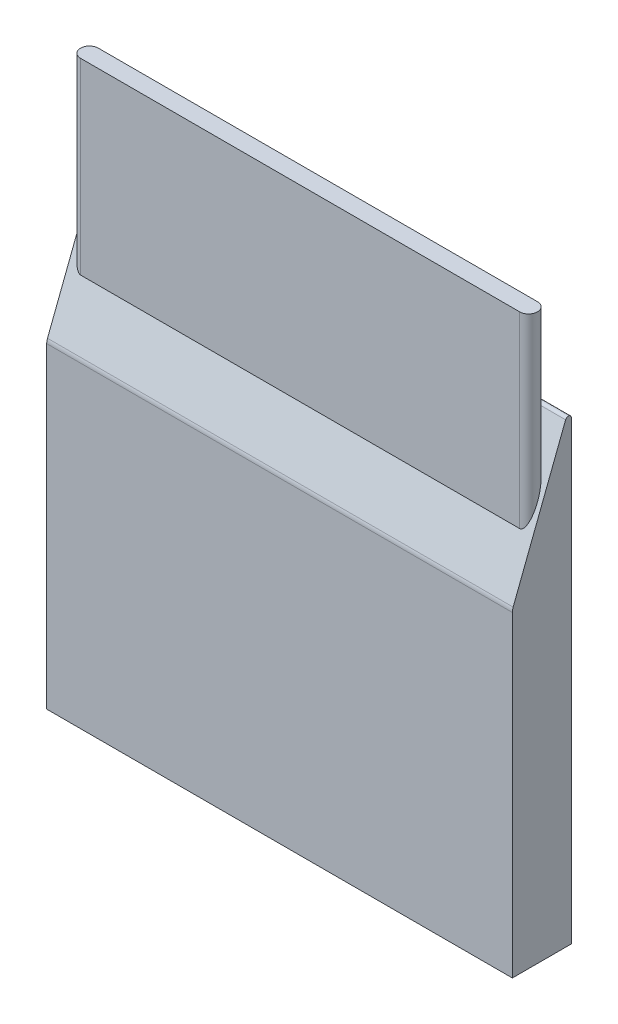
ISO-10303-21;
HEADER;
FILE_DESCRIPTION(('STEP AP214'),'2;1');
FILE_NAME('part.step','',(''),(''),'','','');
FILE_SCHEMA(('AUTOMOTIVE_DESIGN { 1 0 10303 214 1 1 1 1 }'));
ENDSEC;
DATA;
#1=APPLICATION_CONTEXT('core data for automotive mechanical design processes');
#2=APPLICATION_PROTOCOL_DEFINITION('international standard','automotive_design',2000,#1);
#3=PRODUCT_CONTEXT('',#1,'mechanical');
#4=PRODUCT('Part','Part','',(#3));
#5=PRODUCT_RELATED_PRODUCT_CATEGORY('part','',(#4));
#6=PRODUCT_DEFINITION_FORMATION('','',#4);
#7=PRODUCT_DEFINITION_CONTEXT('part definition',#1,'design');
#8=PRODUCT_DEFINITION('design','',#6,#7);
#9=PRODUCT_DEFINITION_SHAPE('','',#8);
#10=(LENGTH_UNIT() NAMED_UNIT(*) SI_UNIT(.MILLI.,.METRE.));
#11=(NAMED_UNIT(*) PLANE_ANGLE_UNIT() SI_UNIT($,.RADIAN.));
#12=(NAMED_UNIT(*) SI_UNIT($,.STERADIAN.) SOLID_ANGLE_UNIT());
#13=UNCERTAINTY_MEASURE_WITH_UNIT(LENGTH_MEASURE(1.E-05),#10,'distance_accuracy_value','');
#14=(GEOMETRIC_REPRESENTATION_CONTEXT(3) GLOBAL_UNCERTAINTY_ASSIGNED_CONTEXT((#13)) GLOBAL_UNIT_ASSIGNED_CONTEXT((#10,
#11,#12)) REPRESENTATION_CONTEXT('',''));
#15=CARTESIAN_POINT('',(0.,0.,0.));
#16=DIRECTION('',(0.,0.,1.));
#17=DIRECTION('',(1.,0.,0.));
#18=AXIS2_PLACEMENT_3D('',#15,#16,#17);
#19=CARTESIAN_POINT('',(65.0657613172395,-0.140861159929711,4.99999999999997));
#20=DIRECTION('',(0.,1.,0.));
#21=DIRECTION('',(0.,0.,1.));
#22=AXIS2_PLACEMENT_3D('',#19,#20,#21);
#23=CYLINDRICAL_SURFACE('',#22,1.5);
#24=DIRECTION('',(0.,1.,0.));
#25=VECTOR('',#24,1.);
#26=CARTESIAN_POINT('',(65.0657613172395,-0.140861159929711,3.49999999999999));
#27=LINE('',#26,#25);
#28=CARTESIAN_POINT('',(65.0657613172395,-0.140861159929711,3.49999999999999));
#29=VERTEX_POINT('',#28);
#30=CARTESIAN_POINT('',(65.0657613172395,34.8591388400703,3.49999999999999));
#31=VERTEX_POINT('',#30);
#32=EDGE_CURVE('E45',#29,#31,#27,.T.);
#33=ORIENTED_EDGE('',*,*,#32,.T.);
#34=CARTESIAN_POINT('',(65.0657613172395,34.8591388400703,4.99999999999997));
#35=DIRECTION('',(0.,1.,0.));
#36=DIRECTION('',(0.,0.,1.));
#37=AXIS2_PLACEMENT_3D('',#34,#35,#36);
#38=CIRCLE('',#37,1.5);
#39=CARTESIAN_POINT('',(65.0657613172395,34.8591388400703,6.49999999999998));
#40=VERTEX_POINT('',#39);
#41=EDGE_CURVE('E82',#40,#31,#38,.T.);
#42=ORIENTED_EDGE('',*,*,#41,.F.);
#43=DIRECTION('',(0.,1.,0.));
#44=VECTOR('',#43,1.);
#45=CARTESIAN_POINT('',(65.0657613172395,-0.140861159929711,6.49999999999998));
#46=LINE('',#45,#44);
#47=CARTESIAN_POINT('',(65.0657613172395,-0.140861159929711,6.49999999999998));
#48=VERTEX_POINT('',#47);
#49=EDGE_CURVE('E12',#48,#40,#46,.T.);
#50=ORIENTED_EDGE('',*,*,#49,.F.);
#51=CARTESIAN_POINT('',(65.0657613172395,-0.140861159929711,4.99999999999997));
#52=DIRECTION('',(0.,1.,0.));
#53=DIRECTION('',(0.,0.,1.));
#54=AXIS2_PLACEMENT_3D('',#51,#52,#53);
#55=CIRCLE('',#54,1.5);
#56=EDGE_CURVE('E83',#48,#29,#55,.T.);
#57=ORIENTED_EDGE('',*,*,#56,.T.);
#58=EDGE_LOOP('',(#33,#42,#50,#57));
#59=FACE_BOUND('',#58,.T.);
#60=ADVANCED_FACE('F42',(#59),#23,.T.);
#61=CARTESIAN_POINT('',(65.0657613172395,-0.140861159929711,6.49999999999998));
#62=DIRECTION('',(0.,0.,1.));
#63=DIRECTION('',(1.,0.,0.));
#64=AXIS2_PLACEMENT_3D('',#61,#62,#63);
#65=PLANE('',#64);
#66=ORIENTED_EDGE('',*,*,#49,.T.);
#67=DIRECTION('',(1.,0.,0.));
#68=VECTOR('',#67,1.);
#69=CARTESIAN_POINT('',(65.0657613172395,34.8591388400703,6.49999999999998));
#70=LINE('',#69,#68);
#71=CARTESIAN_POINT('',(-9.43423868276049,34.8591388400703,6.5));
#72=VERTEX_POINT('',#71);
#73=EDGE_CURVE('E99',#72,#40,#70,.T.);
#74=ORIENTED_EDGE('',*,*,#73,.F.);
#75=DIRECTION('',(0.,1.,0.));
#76=VECTOR('',#75,1.);
#77=CARTESIAN_POINT('',(-9.43423868276049,-0.140861159929711,6.5));
#78=LINE('',#77,#76);
#79=CARTESIAN_POINT('',(-9.43423868276049,-0.140861159929711,6.5));
#80=VERTEX_POINT('',#79);
#81=EDGE_CURVE('E50',#80,#72,#78,.T.);
#82=ORIENTED_EDGE('',*,*,#81,.F.);
#83=DIRECTION('',(1.,0.,0.));
#84=VECTOR('',#83,1.);
#85=CARTESIAN_POINT('',(65.0657613172395,-0.140861159929711,6.49999999999998));
#86=LINE('',#85,#84);
#87=EDGE_CURVE('E88',#80,#48,#86,.T.);
#88=ORIENTED_EDGE('',*,*,#87,.T.);
#89=EDGE_LOOP('',(#66,#74,#82,#88));
#90=FACE_BOUND('',#89,.T.);
#91=ADVANCED_FACE('F114',(#90),#65,.T.);
#92=CARTESIAN_POINT('',(-9.43423868276049,-0.140861159929711,5.));
#93=DIRECTION('',(0.,1.,0.));
#94=DIRECTION('',(0.,0.,1.));
#95=AXIS2_PLACEMENT_3D('',#92,#93,#94);
#96=CYLINDRICAL_SURFACE('',#95,1.5);
#97=ORIENTED_EDGE('',*,*,#81,.T.);
#98=CARTESIAN_POINT('',(-9.43423868276049,34.8591388400703,5.));
#99=DIRECTION('',(0.,1.,0.));
#100=DIRECTION('',(0.,0.,1.));
#101=AXIS2_PLACEMENT_3D('',#98,#99,#100);
#102=CIRCLE('',#101,1.5);
#103=CARTESIAN_POINT('',(-9.43423868276049,34.8591388400703,3.5));
#104=VERTEX_POINT('',#103);
#105=EDGE_CURVE('E95',#104,#72,#102,.T.);
#106=ORIENTED_EDGE('',*,*,#105,.F.);
#107=DIRECTION('',(0.,1.,0.));
#108=VECTOR('',#107,1.);
#109=CARTESIAN_POINT('',(-9.43423868276049,-0.140861159929711,3.5));
#110=LINE('',#109,#108);
#111=CARTESIAN_POINT('',(-9.43423868276049,-0.140861159929711,3.5));
#112=VERTEX_POINT('',#111);
#113=EDGE_CURVE('E87',#112,#104,#110,.T.);
#114=ORIENTED_EDGE('',*,*,#113,.F.);
#115=CARTESIAN_POINT('',(-9.43423868276049,-0.140861159929711,5.));
#116=DIRECTION('',(0.,1.,0.));
#117=DIRECTION('',(0.,0.,1.));
#118=AXIS2_PLACEMENT_3D('',#115,#116,#117);
#119=CIRCLE('',#118,1.5);
#120=EDGE_CURVE('E107',#112,#80,#119,.T.);
#121=ORIENTED_EDGE('',*,*,#120,.T.);
#122=EDGE_LOOP('',(#97,#106,#114,#121));
#123=FACE_BOUND('',#122,.T.);
#124=ADVANCED_FACE('F111',(#123),#96,.T.);
#125=CARTESIAN_POINT('',(65.0657613172395,-0.140861159929711,3.49999999999999));
#126=DIRECTION('',(0.,0.,-1.));
#127=DIRECTION('',(-1.,0.,0.));
#128=AXIS2_PLACEMENT_3D('',#125,#126,#127);
#129=PLANE('',#128);
#130=ORIENTED_EDGE('',*,*,#113,.T.);
#131=DIRECTION('',(-1.,0.,0.));
#132=VECTOR('',#131,1.);
#133=CARTESIAN_POINT('',(65.0657613172395,34.8591388400703,3.49999999999999));
#134=LINE('',#133,#132);
#135=EDGE_CURVE('E90',#31,#104,#134,.T.);
#136=ORIENTED_EDGE('',*,*,#135,.F.);
#137=ORIENTED_EDGE('',*,*,#32,.F.);
#138=DIRECTION('',(-1.,0.,0.));
#139=VECTOR('',#138,1.);
#140=CARTESIAN_POINT('',(65.0657613172395,-0.140861159929711,3.49999999999999));
#141=LINE('',#140,#139);
#142=EDGE_CURVE('E105',#29,#112,#141,.T.);
#143=ORIENTED_EDGE('',*,*,#142,.T.);
#144=EDGE_LOOP('',(#130,#136,#137,#143));
#145=FACE_BOUND('',#144,.T.);
#146=ADVANCED_FACE('F91',(#145),#129,.T.);
#147=CARTESIAN_POINT('',(65.0657613172395,-0.140861159929711,4.99999999999997));
#148=DIRECTION('',(0.,1.,0.));
#149=DIRECTION('',(0.,0.,1.));
#150=AXIS2_PLACEMENT_3D('',#147,#148,#149);
#151=PLANE('',#150);
#152=ORIENTED_EDGE('',*,*,#56,.F.);
#153=ORIENTED_EDGE('',*,*,#87,.F.);
#154=ORIENTED_EDGE('',*,*,#120,.F.);
#155=ORIENTED_EDGE('',*,*,#142,.F.);
#156=EDGE_LOOP('',(#152,#153,#154,#155));
#157=FACE_BOUND('',#156,.T.);
#158=ADVANCED_FACE('F116',(#157),#151,.F.);
#159=CARTESIAN_POINT('',(65.0657613172395,34.8591388400703,4.99999999999997));
#160=DIRECTION('',(0.,1.,0.));
#161=DIRECTION('',(0.,0.,1.));
#162=AXIS2_PLACEMENT_3D('',#159,#160,#161);
#163=PLANE('',#162);
#164=ORIENTED_EDGE('',*,*,#41,.T.);
#165=ORIENTED_EDGE('',*,*,#135,.T.);
#166=ORIENTED_EDGE('',*,*,#105,.T.);
#167=ORIENTED_EDGE('',*,*,#73,.T.);
#168=EDGE_LOOP('',(#164,#165,#166,#167));
#169=FACE_BOUND('',#168,.T.);
#170=ADVANCED_FACE('F98',(#169),#163,.T.);
#171=CLOSED_SHELL('',(#60,#91,#124,#146,#158,#170));
#172=MANIFOLD_SOLID_BREP('B2',#171);
#173=CARTESIAN_POINT('',(-11.6842386827605,19.8591388400703,10.));
#174=DIRECTION('',(1.,0.,0.));
#175=DIRECTION('',(0.,1.,0.));
#176=AXIS2_PLACEMENT_3D('',#173,#174,#175);
#177=PLANE('',#176);
#178=DIRECTION('',(0.,-1.,0.));
#179=VECTOR('',#178,1.);
#180=CARTESIAN_POINT('',(-11.6842386827605,19.8591388400703,10.));
#181=LINE('',#180,#179);
#182=CARTESIAN_POINT('',(-11.6842386827605,-6.43328590971268,10.));
#183=VERTEX_POINT('',#182);
#184=CARTESIAN_POINT('',(-11.6842386827605,-60.1408611599297,10.));
#185=VERTEX_POINT('',#184);
#186=EDGE_CURVE('E214',#183,#185,#181,.T.);
#187=ORIENTED_EDGE('',*,*,#186,.F.);
#188=CARTESIAN_POINT('',(-11.6842386827605,-6.43328590971268,8.));
#189=DIRECTION('',(1.,0.,0.));
#190=DIRECTION('',(0.,1.,0.));
#191=AXIS2_PLACEMENT_3D('',#188,#189,#190);
#192=CIRCLE('',#191,2.);
#193=CARTESIAN_POINT('',(-11.6842386827605,-5.71339853966304,9.86594806316869));
#194=VERTEX_POINT('',#193);
#195=EDGE_CURVE('E40',#183,#194,#192,.F.);
#196=ORIENTED_EDGE('',*,*,#195,.T.);
#197=DIRECTION('',(0.,0.932974031584347,-0.359943685024825));
#198=VECTOR('',#197,1.);
#199=CARTESIAN_POINT('',(-11.6842386827605,16.5009577304609,1.29559456389248));
#200=LINE('',#199,#198);
#201=CARTESIAN_POINT('',(-11.6842386827605,17.3540044951369,0.966487015792173));
#202=VERTEX_POINT('',#201);
#203=EDGE_CURVE('E257',#194,#202,#200,.T.);
#204=ORIENTED_EDGE('',*,*,#203,.T.);
#205=CARTESIAN_POINT('',(-11.6842386827605,17.1740326526245,0.5));
#206=DIRECTION('',(1.,0.,0.));
#207=DIRECTION('',(0.,1.,0.));
#208=AXIS2_PLACEMENT_3D('',#205,#206,#207);
#209=CIRCLE('',#208,0.5);
#210=CARTESIAN_POINT('',(-11.6842386827605,17.1740326526245,0.));
#211=VERTEX_POINT('',#210);
#212=EDGE_CURVE('E238',#202,#211,#209,.F.);
#213=ORIENTED_EDGE('',*,*,#212,.T.);
#214=DIRECTION('',(0.,-1.,0.));
#215=VECTOR('',#214,1.);
#216=CARTESIAN_POINT('',(-11.6842386827605,19.8591388400703,0.));
#217=LINE('',#216,#215);
#218=CARTESIAN_POINT('',(-11.6842386827605,-60.1408611599297,0.));
#219=VERTEX_POINT('',#218);
#220=EDGE_CURVE('E233',#211,#219,#217,.T.);
#221=ORIENTED_EDGE('',*,*,#220,.T.);
#222=DIRECTION('',(0.,0.,-1.));
#223=VECTOR('',#222,1.);
#224=CARTESIAN_POINT('',(-11.6842386827605,-60.1408611599297,10.));
#225=LINE('',#224,#223);
#226=EDGE_CURVE('E227',#185,#219,#225,.T.);
#227=ORIENTED_EDGE('',*,*,#226,.F.);
#228=EDGE_LOOP('',(#187,#196,#204,#213,#221,#227));
#229=FACE_BOUND('',#228,.T.);
#230=ADVANCED_FACE('F165',(#229),#177,.F.);
#231=CARTESIAN_POINT('',(-11.6842386827605,-60.1408611599297,10.));
#232=DIRECTION('',(0.,1.,0.));
#233=DIRECTION('',(0.,0.,1.));
#234=AXIS2_PLACEMENT_3D('',#231,#232,#233);
#235=PLANE('',#234);
#236=DIRECTION('',(1.,0.,0.));
#237=VECTOR('',#236,1.);
#238=CARTESIAN_POINT('',(-11.6842386827605,-60.1408611599297,0.));
#239=LINE('',#238,#237);
#240=CARTESIAN_POINT('',(67.3157613172395,-60.1408611599297,0.));
#241=VERTEX_POINT('',#240);
#242=EDGE_CURVE('E268',#219,#241,#239,.T.);
#243=ORIENTED_EDGE('',*,*,#242,.T.);
#244=DIRECTION('',(0.,0.,-1.));
#245=VECTOR('',#244,1.);
#246=CARTESIAN_POINT('',(67.3157613172395,-60.1408611599297,10.));
#247=LINE('',#246,#245);
#248=CARTESIAN_POINT('',(67.3157613172395,-60.1408611599297,10.));
#249=VERTEX_POINT('',#248);
#250=EDGE_CURVE('E229',#249,#241,#247,.T.);
#251=ORIENTED_EDGE('',*,*,#250,.F.);
#252=DIRECTION('',(1.,0.,0.));
#253=VECTOR('',#252,1.);
#254=CARTESIAN_POINT('',(-11.6842386827605,-60.1408611599297,10.));
#255=LINE('',#254,#253);
#256=EDGE_CURVE('E217',#185,#249,#255,.T.);
#257=ORIENTED_EDGE('',*,*,#256,.F.);
#258=ORIENTED_EDGE('',*,*,#226,.T.);
#259=EDGE_LOOP('',(#243,#251,#257,#258));
#260=FACE_BOUND('',#259,.T.);
#261=ADVANCED_FACE('F226',(#260),#235,.F.);
#262=CARTESIAN_POINT('',(67.3157613172395,19.8591388400703,10.));
#263=DIRECTION('',(-1.,0.,0.));
#264=DIRECTION('',(0.,-1.,0.));
#265=AXIS2_PLACEMENT_3D('',#262,#263,#264);
#266=PLANE('',#265);
#267=DIRECTION('',(0.,0.932974031584347,-0.359943685024825));
#268=VECTOR('',#267,1.);
#269=CARTESIAN_POINT('',(67.3157613172395,-6.06086115992971,10.));
#270=LINE('',#269,#268);
#271=CARTESIAN_POINT('',(67.3157613172395,-5.71339853966298,9.86594806316869));
#272=VERTEX_POINT('',#271);
#273=CARTESIAN_POINT('',(67.3157613172395,17.354004495137,0.966487015792173));
#274=VERTEX_POINT('',#273);
#275=EDGE_CURVE('E256',#272,#274,#270,.T.);
#276=ORIENTED_EDGE('',*,*,#275,.F.);
#277=CARTESIAN_POINT('',(67.3157613172395,-6.43328590971263,8.));
#278=DIRECTION('',(-1.,0.,0.));
#279=DIRECTION('',(0.,-1.,0.));
#280=AXIS2_PLACEMENT_3D('',#277,#278,#279);
#281=CIRCLE('',#280,2.);
#282=CARTESIAN_POINT('',(67.3157613172395,-6.43328590971263,10.));
#283=VERTEX_POINT('',#282);
#284=EDGE_CURVE('E187',#272,#283,#281,.F.);
#285=ORIENTED_EDGE('',*,*,#284,.T.);
#286=DIRECTION('',(0.,1.,0.));
#287=VECTOR('',#286,1.);
#288=CARTESIAN_POINT('',(67.3157613172395,19.8591388400703,10.));
#289=LINE('',#288,#287);
#290=EDGE_CURVE('E230',#249,#283,#289,.T.);
#291=ORIENTED_EDGE('',*,*,#290,.F.);
#292=ORIENTED_EDGE('',*,*,#250,.T.);
#293=DIRECTION('',(0.,1.,0.));
#294=VECTOR('',#293,1.);
#295=CARTESIAN_POINT('',(67.3157613172395,19.8591388400703,0.));
#296=LINE('',#295,#294);
#297=CARTESIAN_POINT('',(67.3157613172395,17.1740326526246,0.));
#298=VERTEX_POINT('',#297);
#299=EDGE_CURVE('E222',#241,#298,#296,.T.);
#300=ORIENTED_EDGE('',*,*,#299,.T.);
#301=CARTESIAN_POINT('',(67.3157613172395,17.1740326526246,0.5));
#302=DIRECTION('',(-1.,0.,0.));
#303=DIRECTION('',(0.,-1.,0.));
#304=AXIS2_PLACEMENT_3D('',#301,#302,#303);
#305=CIRCLE('',#304,0.5);
#306=EDGE_CURVE('E246',#298,#274,#305,.F.);
#307=ORIENTED_EDGE('',*,*,#306,.T.);
#308=EDGE_LOOP('',(#276,#285,#291,#292,#300,#307));
#309=FACE_BOUND('',#308,.T.);
#310=ADVANCED_FACE('F259',(#309),#266,.F.);
#311=CARTESIAN_POINT('',(0.,0.,10.));
#312=DIRECTION('',(0.,0.,1.));
#313=DIRECTION('',(1.,0.,0.));
#314=AXIS2_PLACEMENT_3D('',#311,#312,#313);
#315=PLANE('',#314);
#316=ORIENTED_EDGE('',*,*,#290,.T.);
#317=DIRECTION('',(1.,0.,0.));
#318=VECTOR('',#317,1.);
#319=CARTESIAN_POINT('',(-11.6842386827605,-6.43328590971268,10.));
#320=LINE('',#319,#318);
#321=EDGE_CURVE('E173',#283,#183,#320,.F.);
#322=ORIENTED_EDGE('',*,*,#321,.T.);
#323=ORIENTED_EDGE('',*,*,#186,.T.);
#324=ORIENTED_EDGE('',*,*,#256,.T.);
#325=EDGE_LOOP('',(#316,#322,#323,#324));
#326=FACE_BOUND('',#325,.T.);
#327=ADVANCED_FACE('F216',(#326),#315,.T.);
#328=CARTESIAN_POINT('',(0.,0.,0.));
#329=DIRECTION('',(0.,0.,1.));
#330=DIRECTION('',(1.,0.,0.));
#331=AXIS2_PLACEMENT_3D('',#328,#329,#330);
#332=PLANE('',#331);
#333=ORIENTED_EDGE('',*,*,#220,.F.);
#334=DIRECTION('',(-1.,0.,0.));
#335=VECTOR('',#334,1.);
#336=CARTESIAN_POINT('',(0.,17.1740326526245,0.));
#337=LINE('',#336,#335);
#338=EDGE_CURVE('E244',#211,#298,#337,.F.);
#339=ORIENTED_EDGE('',*,*,#338,.T.);
#340=ORIENTED_EDGE('',*,*,#299,.F.);
#341=ORIENTED_EDGE('',*,*,#242,.F.);
#342=EDGE_LOOP('',(#333,#339,#340,#341));
#343=FACE_BOUND('',#342,.T.);
#344=ADVANCED_FACE('F275',(#343),#332,.F.);
#345=CARTESIAN_POINT('',(-12.6842386827605,-6.06086115992977,10.));
#346=DIRECTION('',(0.,-0.359943685024825,-0.932974031584347));
#347=DIRECTION('',(0.,0.932974031584347,-0.359943685024825));
#348=AXIS2_PLACEMENT_3D('',#345,#346,#347);
#349=PLANE('',#348);
#350=ORIENTED_EDGE('',*,*,#203,.F.);
#351=DIRECTION('',(1.,0.,0.));
#352=VECTOR('',#351,1.);
#353=CARTESIAN_POINT('',(67.3157613172395,-5.71339853966298,9.86594806316869));
#354=LINE('',#353,#352);
#355=EDGE_CURVE('E249',#194,#272,#354,.T.);
#356=ORIENTED_EDGE('',*,*,#355,.T.);
#357=ORIENTED_EDGE('',*,*,#275,.T.);
#358=DIRECTION('',(-1.,0.,0.));
#359=VECTOR('',#358,1.);
#360=CARTESIAN_POINT('',(-12.6842386827605,17.3540044951369,0.966487015792173));
#361=LINE('',#360,#359);
#362=EDGE_CURVE('E235',#274,#202,#361,.T.);
#363=ORIENTED_EDGE('',*,*,#362,.T.);
#364=EDGE_LOOP('',(#350,#356,#357,#363));
#365=FACE_BOUND('',#364,.T.);
#366=ADVANCED_FACE('F255',(#365),#349,.F.);
#367=CARTESIAN_POINT('',(-12.6842386827605,17.1740326526245,0.5));
#368=DIRECTION('',(-1.,0.,0.));
#369=DIRECTION('',(0.,-1.,0.));
#370=AXIS2_PLACEMENT_3D('',#367,#368,#369);
#371=CYLINDRICAL_SURFACE('',#370,0.5);
#372=ORIENTED_EDGE('',*,*,#306,.F.);
#373=ORIENTED_EDGE('',*,*,#338,.F.);
#374=ORIENTED_EDGE('',*,*,#212,.F.);
#375=ORIENTED_EDGE('',*,*,#362,.F.);
#376=EDGE_LOOP('',(#372,#373,#374,#375));
#377=FACE_BOUND('',#376,.T.);
#378=ADVANCED_FACE('F273',(#377),#371,.T.);
#379=CARTESIAN_POINT('',(-12.6842386827605,-6.43328590971268,8.));
#380=DIRECTION('',(-1.,0.,0.));
#381=DIRECTION('',(0.,-1.,0.));
#382=AXIS2_PLACEMENT_3D('',#379,#380,#381);
#383=CYLINDRICAL_SURFACE('',#382,2.);
#384=ORIENTED_EDGE('',*,*,#195,.F.);
#385=ORIENTED_EDGE('',*,*,#321,.F.);
#386=ORIENTED_EDGE('',*,*,#284,.F.);
#387=ORIENTED_EDGE('',*,*,#355,.F.);
#388=EDGE_LOOP('',(#384,#385,#386,#387));
#389=FACE_BOUND('',#388,.T.);
#390=ADVANCED_FACE('F167',(#389),#383,.T.);
#391=CLOSED_SHELL('',(#230,#261,#310,#327,#344,#366,#378,#390));
#392=MANIFOLD_SOLID_BREP('B6',#391);
#393=ADVANCED_BREP_SHAPE_REPRESENTATION('',(#18,#172,#392),#14);
#394=SHAPE_DEFINITION_REPRESENTATION(#9,#393);
ENDSEC;
END-ISO-10303-21;
